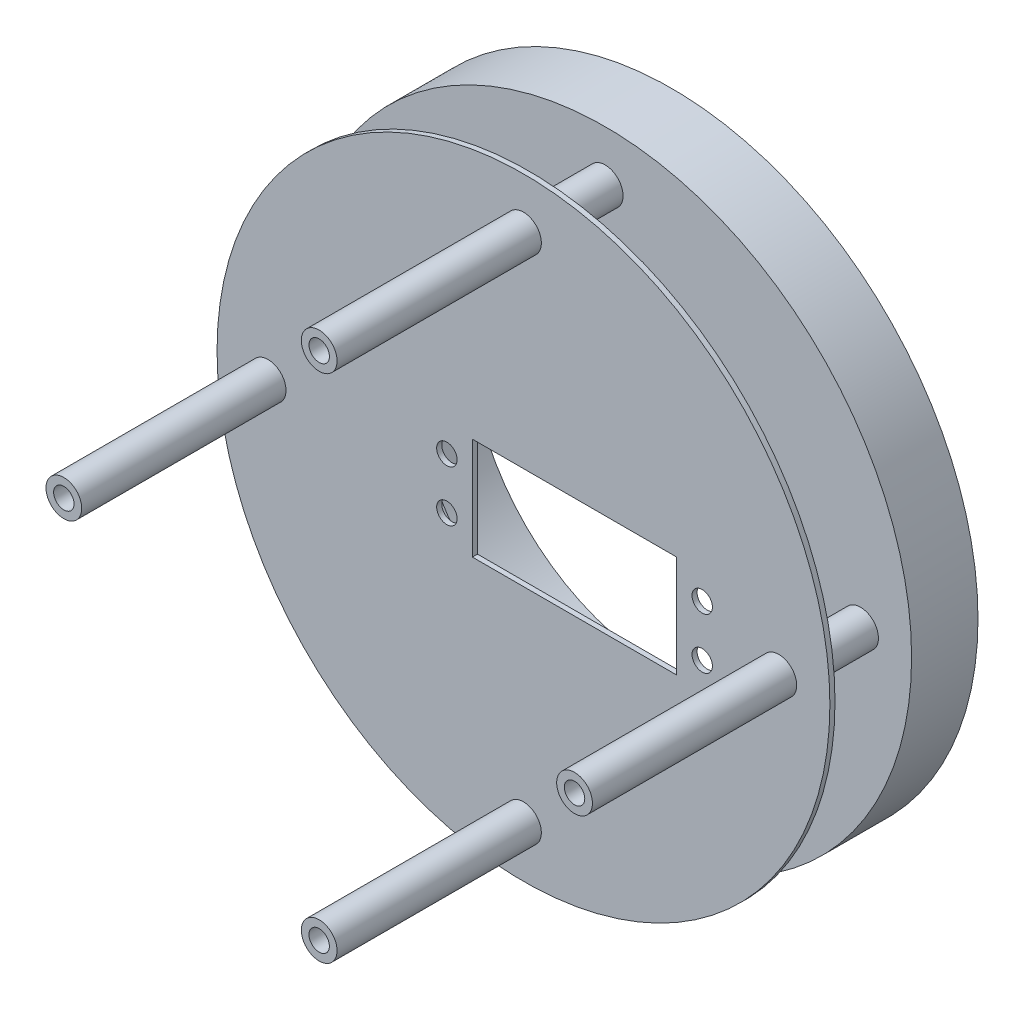
ISO-10303-21;
HEADER;
FILE_DESCRIPTION(('STEP AP214'),'2;1');
FILE_NAME('part.step','',(''),(''),'','','');
FILE_SCHEMA(('AUTOMOTIVE_DESIGN { 1 0 10303 214 1 1 1 1 }'));
ENDSEC;
DATA;
#1=APPLICATION_CONTEXT('core data for automotive mechanical design processes');
#2=APPLICATION_PROTOCOL_DEFINITION('international standard','automotive_design',2000,#1);
#3=PRODUCT_CONTEXT('',#1,'mechanical');
#4=PRODUCT('Part','Part','',(#3));
#5=PRODUCT_RELATED_PRODUCT_CATEGORY('part','',(#4));
#6=PRODUCT_DEFINITION_FORMATION('','',#4);
#7=PRODUCT_DEFINITION_CONTEXT('part definition',#1,'design');
#8=PRODUCT_DEFINITION('design','',#6,#7);
#9=PRODUCT_DEFINITION_SHAPE('','',#8);
#10=(LENGTH_UNIT() NAMED_UNIT(*) SI_UNIT(.MILLI.,.METRE.));
#11=(NAMED_UNIT(*) PLANE_ANGLE_UNIT() SI_UNIT($,.RADIAN.));
#12=(NAMED_UNIT(*) SI_UNIT($,.STERADIAN.) SOLID_ANGLE_UNIT());
#13=UNCERTAINTY_MEASURE_WITH_UNIT(LENGTH_MEASURE(1.E-05),#10,'distance_accuracy_value','');
#14=(GEOMETRIC_REPRESENTATION_CONTEXT(3) GLOBAL_UNCERTAINTY_ASSIGNED_CONTEXT((#13)) GLOBAL_UNIT_ASSIGNED_CONTEXT((#10,
#11,#12)) REPRESENTATION_CONTEXT('',''));
#15=CARTESIAN_POINT('',(0.,0.,0.));
#16=DIRECTION('',(0.,0.,1.));
#17=DIRECTION('',(1.,0.,0.));
#18=AXIS2_PLACEMENT_3D('',#15,#16,#17);
#19=CARTESIAN_POINT('',(0.,0.,13.));
#20=DIRECTION('',(0.,0.,-1.));
#21=DIRECTION('',(-1.,0.,0.));
#22=AXIS2_PLACEMENT_3D('',#19,#20,#21);
#23=CYLINDRICAL_SURFACE('',#22,37.5);
#24=CARTESIAN_POINT('',(0.,0.,13.));
#25=DIRECTION('',(0.,0.,1.));
#26=DIRECTION('',(1.,0.,0.));
#27=AXIS2_PLACEMENT_3D('',#24,#25,#26);
#28=CIRCLE('',#27,37.5);
#29=CARTESIAN_POINT('',(-37.5,0.,13.));
#30=VERTEX_POINT('',#29);
#31=EDGE_CURVE('E127',#30,#30,#28,.T.);
#32=CARTESIAN_POINT('',(0.,0.,2.));
#33=DIRECTION('',(0.,0.,-1.));
#34=DIRECTION('',(-1.,0.,0.));
#35=AXIS2_PLACEMENT_3D('',#32,#33,#34);
#36=CIRCLE('',#35,37.5);
#37=CARTESIAN_POINT('',(-37.5,0.,2.));
#38=VERTEX_POINT('',#37);
#39=EDGE_CURVE('E40',#38,#38,#36,.T.);
#40=CARTESIAN_POINT('',(-37.5,0.,13.));
#41=CARTESIAN_POINT('',(-37.5,0.,12.8854166666667));
#42=CARTESIAN_POINT('',(-37.5,0.,12.7708333333333));
#43=CARTESIAN_POINT('',(-37.5,0.,12.5416666666667));
#44=CARTESIAN_POINT('',(-37.5,0.,12.4270833333333));
#45=CARTESIAN_POINT('',(-37.5,0.,12.1979166666667));
#46=CARTESIAN_POINT('',(-37.5,0.,12.0833333333333));
#47=CARTESIAN_POINT('',(-37.5,0.,11.8541666666667));
#48=CARTESIAN_POINT('',(-37.5,0.,11.7395833333333));
#49=CARTESIAN_POINT('',(-37.5,0.,11.5104166666667));
#50=CARTESIAN_POINT('',(-37.5,0.,11.3958333333333));
#51=CARTESIAN_POINT('',(-37.5,0.,11.1666666666667));
#52=CARTESIAN_POINT('',(-37.5,0.,11.0520833333333));
#53=CARTESIAN_POINT('',(-37.5,0.,10.8229166666667));
#54=CARTESIAN_POINT('',(-37.5,0.,10.7083333333333));
#55=CARTESIAN_POINT('',(-37.5,0.,10.4791666666667));
#56=CARTESIAN_POINT('',(-37.5,0.,10.3645833333333));
#57=CARTESIAN_POINT('',(-37.5,0.,10.1354166666667));
#58=CARTESIAN_POINT('',(-37.5,0.,10.0208333333333));
#59=CARTESIAN_POINT('',(-37.5,0.,9.79166666666667));
#60=CARTESIAN_POINT('',(-37.5,0.,9.67708333333333));
#61=CARTESIAN_POINT('',(-37.5,0.,9.44791666666667));
#62=CARTESIAN_POINT('',(-37.5,0.,9.33333333333333));
#63=CARTESIAN_POINT('',(-37.5,0.,9.10416666666667));
#64=CARTESIAN_POINT('',(-37.5,0.,8.98958333333333));
#65=CARTESIAN_POINT('',(-37.5,0.,8.76041666666667));
#66=CARTESIAN_POINT('',(-37.5,0.,8.64583333333333));
#67=CARTESIAN_POINT('',(-37.5,0.,8.41666666666667));
#68=CARTESIAN_POINT('',(-37.5,0.,8.30208333333333));
#69=CARTESIAN_POINT('',(-37.5,0.,8.07291666666667));
#70=CARTESIAN_POINT('',(-37.5,0.,7.95833333333333));
#71=CARTESIAN_POINT('',(-37.5,0.,7.72916666666667));
#72=CARTESIAN_POINT('',(-37.5,0.,7.61458333333333));
#73=CARTESIAN_POINT('',(-37.5,0.,7.38541666666667));
#74=CARTESIAN_POINT('',(-37.5,0.,7.27083333333333));
#75=CARTESIAN_POINT('',(-37.5,0.,7.04166666666667));
#76=CARTESIAN_POINT('',(-37.5,0.,6.92708333333333));
#77=CARTESIAN_POINT('',(-37.5,0.,6.69791666666667));
#78=CARTESIAN_POINT('',(-37.5,0.,6.58333333333333));
#79=CARTESIAN_POINT('',(-37.5,0.,6.35416666666667));
#80=CARTESIAN_POINT('',(-37.5,0.,6.23958333333333));
#81=CARTESIAN_POINT('',(-37.5,0.,6.01041666666667));
#82=CARTESIAN_POINT('',(-37.5,0.,5.89583333333333));
#83=CARTESIAN_POINT('',(-37.5,0.,5.66666666666667));
#84=CARTESIAN_POINT('',(-37.5,0.,5.55208333333333));
#85=CARTESIAN_POINT('',(-37.5,0.,5.32291666666667));
#86=CARTESIAN_POINT('',(-37.5,0.,5.20833333333333));
#87=CARTESIAN_POINT('',(-37.5,0.,4.97916666666667));
#88=CARTESIAN_POINT('',(-37.5,0.,4.86458333333333));
#89=CARTESIAN_POINT('',(-37.5,0.,4.63541666666667));
#90=CARTESIAN_POINT('',(-37.5,0.,4.52083333333333));
#91=CARTESIAN_POINT('',(-37.5,0.,4.29166666666667));
#92=CARTESIAN_POINT('',(-37.5,0.,4.17708333333334));
#93=CARTESIAN_POINT('',(-37.5,0.,3.94791666666667));
#94=CARTESIAN_POINT('',(-37.5,0.,3.83333333333333));
#95=CARTESIAN_POINT('',(-37.5,0.,3.60416666666667));
#96=CARTESIAN_POINT('',(-37.5,0.,3.48958333333333));
#97=CARTESIAN_POINT('',(-37.5,0.,3.26041666666667));
#98=CARTESIAN_POINT('',(-37.5,0.,3.14583333333333));
#99=CARTESIAN_POINT('',(-37.5,0.,2.91666666666667));
#100=CARTESIAN_POINT('',(-37.5,0.,2.80208333333334));
#101=CARTESIAN_POINT('',(-37.5,0.,2.57291666666667));
#102=CARTESIAN_POINT('',(-37.5,0.,2.45833333333334));
#103=CARTESIAN_POINT('',(-37.5,0.,2.22916666666667));
#104=CARTESIAN_POINT('',(-37.5,0.,2.11458333333334));
#105=CARTESIAN_POINT('',(-37.5,0.,2.));
#106=B_SPLINE_CURVE_WITH_KNOTS('',3,(#40,#41,#42,#43,#44,#45,#46,#47,#48,#49,#50,#51,#52,#53,
#54,#55,#56,#57,#58,#59,#60,#61,#62,#63,#64,#65,#66,#67,#68,#69,#70,#71,#72,#73,#74,#75,#76,#77,
#78,#79,#80,#81,#82,#83,#84,#85,#86,#87,#88,#89,#90,#91,#92,#93,#94,#95,#96,#97,#98,#99,#100,
#101,#102,#103,#104,#105),.UNSPECIFIED.,.F.,.F.,(4,2,2,2,2,2,2,2,2,2,2,2,2,2,2,2,2,2,2,2,2,2,2,
2,2,2,2,2,2,2,2,2,4),(0.,0.34375,0.687500000000001,1.03125,1.375,1.71875,2.0625,2.40625,2.75,
3.09375,3.4375,3.78125,4.125,4.46875,4.8125,5.15625,5.5,5.84375,6.1875,6.53125,6.875,7.21875,
7.5625,7.90625,8.25,8.59375,8.9375,9.28125,9.625,9.96875,10.3125,10.65625,11.),.UNSPECIFIED.);
#107=EDGE_CURVE('BSEAM36',#30,#38,#106,.T.);
#108=ORIENTED_EDGE('',*,*,#31,.T.);
#109=ORIENTED_EDGE('',*,*,#39,.T.);
#110=ORIENTED_EDGE('',*,*,#107,.T.);
#111=ORIENTED_EDGE('',*,*,#107,.F.);
#112=EDGE_LOOP('',(#108,#110,#109,#111));
#113=FACE_BOUND('',#112,.T.);
#114=ADVANCED_FACE('F36',(#113),#23,.F.);
#115=CARTESIAN_POINT('',(50.,0.,69.));
#116=DIRECTION('',(0.,0.,-1.));
#117=DIRECTION('',(-1.,0.,0.));
#118=AXIS2_PLACEMENT_3D('',#115,#116,#117);
#119=CYLINDRICAL_SURFACE('',#118,3.5);
#120=CARTESIAN_POINT('',(50.,0.,13.));
#121=DIRECTION('',(0.,0.,1.));
#122=DIRECTION('',(1.,0.,0.));
#123=AXIS2_PLACEMENT_3D('',#120,#121,#122);
#124=CIRCLE('',#123,3.5);
#125=CARTESIAN_POINT('',(53.5,0.,13.));
#126=VERTEX_POINT('',#125);
#127=EDGE_CURVE('E128',#126,#126,#124,.T.);
#128=ORIENTED_EDGE('',*,*,#127,.T.);
#129=EDGE_LOOP('',(#128));
#130=FACE_BOUND('',#129,.T.);
#131=CARTESIAN_POINT('',(50.,0.,28.));
#132=DIRECTION('',(0.,0.,1.));
#133=DIRECTION('',(1.,0.,0.));
#134=AXIS2_PLACEMENT_3D('',#131,#132,#133);
#135=CIRCLE('',#134,3.5);
#136=CARTESIAN_POINT('',(53.5,0.,28.));
#137=VERTEX_POINT('',#136);
#138=EDGE_CURVE('E137',#137,#137,#135,.T.);
#139=ORIENTED_EDGE('',*,*,#138,.F.);
#140=EDGE_LOOP('',(#139));
#141=FACE_BOUND('',#140,.T.);
#142=ADVANCED_FACE('F219',(#130,#141),#119,.T.);
#143=CARTESIAN_POINT('',(0.,0.,13.));
#144=DIRECTION('',(0.,0.,1.));
#145=DIRECTION('',(1.,0.,0.));
#146=AXIS2_PLACEMENT_3D('',#143,#144,#145);
#147=PLANE('',#146);
#148=CARTESIAN_POINT('',(0.,50.,13.));
#149=DIRECTION('',(0.,0.,1.));
#150=DIRECTION('',(1.,0.,0.));
#151=AXIS2_PLACEMENT_3D('',#148,#149,#150);
#152=CIRCLE('',#151,3.5);
#153=CARTESIAN_POINT('',(3.5,50.,13.));
#154=VERTEX_POINT('',#153);
#155=EDGE_CURVE('E255',#154,#154,#152,.T.);
#156=ORIENTED_EDGE('',*,*,#155,.F.);
#157=EDGE_LOOP('',(#156));
#158=FACE_BOUND('',#157,.T.);
#159=CARTESIAN_POINT('',(-50.,0.,13.));
#160=DIRECTION('',(0.,0.,1.));
#161=DIRECTION('',(1.,0.,0.));
#162=AXIS2_PLACEMENT_3D('',#159,#160,#161);
#163=CIRCLE('',#162,3.5);
#164=CARTESIAN_POINT('',(-46.5,0.,13.));
#165=VERTEX_POINT('',#164);
#166=EDGE_CURVE('E285',#165,#165,#163,.T.);
#167=ORIENTED_EDGE('',*,*,#166,.F.);
#168=EDGE_LOOP('',(#167));
#169=FACE_BOUND('',#168,.T.);
#170=CARTESIAN_POINT('',(0.,-50.,13.));
#171=DIRECTION('',(0.,0.,1.));
#172=DIRECTION('',(1.,0.,0.));
#173=AXIS2_PLACEMENT_3D('',#170,#171,#172);
#174=CIRCLE('',#173,3.5);
#175=CARTESIAN_POINT('',(3.5,-50.,13.));
#176=VERTEX_POINT('',#175);
#177=EDGE_CURVE('E294',#176,#176,#174,.T.);
#178=ORIENTED_EDGE('',*,*,#177,.F.);
#179=EDGE_LOOP('',(#178));
#180=FACE_BOUND('',#179,.T.);
#181=ORIENTED_EDGE('',*,*,#127,.F.);
#182=EDGE_LOOP('',(#181));
#183=FACE_BOUND('',#182,.T.);
#184=CARTESIAN_POINT('',(0.,0.,13.));
#185=DIRECTION('',(0.,0.,1.));
#186=DIRECTION('',(1.,0.,0.));
#187=AXIS2_PLACEMENT_3D('',#184,#185,#186);
#188=CIRCLE('',#187,60.);
#189=CARTESIAN_POINT('',(-60.,0.,13.));
#190=VERTEX_POINT('',#189);
#191=EDGE_CURVE('E134',#190,#190,#188,.T.);
#192=ORIENTED_EDGE('',*,*,#191,.T.);
#193=EDGE_LOOP('',(#192));
#194=FACE_BOUND('',#193,.T.);
#195=ORIENTED_EDGE('',*,*,#31,.F.);
#196=EDGE_LOOP('',(#195));
#197=FACE_BOUND('',#196,.T.);
#198=ADVANCED_FACE('F225',(#158,#169,#180,#183,#194,#197),#147,.T.);
#199=CARTESIAN_POINT('',(0.,0.,0.));
#200=DIRECTION('',(0.,0.,1.));
#201=DIRECTION('',(1.,0.,0.));
#202=AXIS2_PLACEMENT_3D('',#199,#200,#201);
#203=PLANE('',#202);
#204=CARTESIAN_POINT('',(0.,0.,0.));
#205=DIRECTION('',(0.,0.,-1.));
#206=DIRECTION('',(-1.,0.,0.));
#207=AXIS2_PLACEMENT_3D('',#204,#205,#206);
#208=CIRCLE('',#207,45.);
#209=CARTESIAN_POINT('',(-45.,0.,0.));
#210=VERTEX_POINT('',#209);
#211=EDGE_CURVE('E243',#210,#210,#208,.T.);
#212=ORIENTED_EDGE('',*,*,#211,.F.);
#213=EDGE_LOOP('',(#212));
#214=FACE_BOUND('',#213,.T.);
#215=CARTESIAN_POINT('',(0.,0.,0.));
#216=DIRECTION('',(0.,0.,1.));
#217=DIRECTION('',(1.,0.,0.));
#218=AXIS2_PLACEMENT_3D('',#215,#216,#217);
#219=CIRCLE('',#218,60.);
#220=CARTESIAN_POINT('',(-60.,0.,0.));
#221=VERTEX_POINT('',#220);
#222=EDGE_CURVE('E133',#221,#221,#219,.T.);
#223=ORIENTED_EDGE('',*,*,#222,.F.);
#224=EDGE_LOOP('',(#223));
#225=FACE_BOUND('',#224,.T.);
#226=ADVANCED_FACE('F232',(#214,#225),#203,.F.);
#227=CARTESIAN_POINT('',(0.,0.,13.));
#228=DIRECTION('',(0.,0.,-1.));
#229=DIRECTION('',(-1.,0.,0.));
#230=AXIS2_PLACEMENT_3D('',#227,#228,#229);
#231=CYLINDRICAL_SURFACE('',#230,60.);
#232=CARTESIAN_POINT('',(-60.,0.,13.));
#233=CARTESIAN_POINT('',(-60.,0.,12.8645833333333));
#234=CARTESIAN_POINT('',(-60.,0.,12.7291666666667));
#235=CARTESIAN_POINT('',(-60.,0.,12.4583333333333));
#236=CARTESIAN_POINT('',(-60.,0.,12.3229166666667));
#237=CARTESIAN_POINT('',(-60.,0.,12.0520833333333));
#238=CARTESIAN_POINT('',(-60.,0.,11.9166666666667));
#239=CARTESIAN_POINT('',(-60.,0.,11.6458333333333));
#240=CARTESIAN_POINT('',(-60.,0.,11.5104166666667));
#241=CARTESIAN_POINT('',(-60.,0.,11.2395833333333));
#242=CARTESIAN_POINT('',(-60.,0.,11.1041666666667));
#243=CARTESIAN_POINT('',(-60.,0.,10.8333333333333));
#244=CARTESIAN_POINT('',(-60.,0.,10.6979166666667));
#245=CARTESIAN_POINT('',(-60.,0.,10.4270833333333));
#246=CARTESIAN_POINT('',(-60.,0.,10.2916666666667));
#247=CARTESIAN_POINT('',(-60.,0.,10.0208333333333));
#248=CARTESIAN_POINT('',(-60.,0.,9.88541666666667));
#249=CARTESIAN_POINT('',(-60.,0.,9.61458333333333));
#250=CARTESIAN_POINT('',(-60.,0.,9.47916666666667));
#251=CARTESIAN_POINT('',(-60.,0.,9.20833333333333));
#252=CARTESIAN_POINT('',(-60.,0.,9.07291666666666));
#253=CARTESIAN_POINT('',(-60.,0.,8.80208333333333));
#254=CARTESIAN_POINT('',(-60.,0.,8.66666666666667));
#255=CARTESIAN_POINT('',(-60.,0.,8.39583333333333));
#256=CARTESIAN_POINT('',(-60.,0.,8.26041666666667));
#257=CARTESIAN_POINT('',(-60.,0.,7.98958333333333));
#258=CARTESIAN_POINT('',(-60.,0.,7.85416666666667));
#259=CARTESIAN_POINT('',(-60.,0.,7.58333333333333));
#260=CARTESIAN_POINT('',(-60.,0.,7.44791666666667));
#261=CARTESIAN_POINT('',(-60.,0.,7.17708333333333));
#262=CARTESIAN_POINT('',(-60.,0.,7.04166666666667));
#263=CARTESIAN_POINT('',(-60.,0.,6.77083333333333));
#264=CARTESIAN_POINT('',(-60.,0.,6.63541666666667));
#265=CARTESIAN_POINT('',(-60.,0.,6.36458333333333));
#266=CARTESIAN_POINT('',(-60.,0.,6.22916666666667));
#267=CARTESIAN_POINT('',(-60.,0.,5.95833333333333));
#268=CARTESIAN_POINT('',(-60.,0.,5.82291666666667));
#269=CARTESIAN_POINT('',(-60.,0.,5.55208333333333));
#270=CARTESIAN_POINT('',(-60.,0.,5.41666666666667));
#271=CARTESIAN_POINT('',(-60.,0.,5.14583333333333));
#272=CARTESIAN_POINT('',(-60.,0.,5.01041666666667));
#273=CARTESIAN_POINT('',(-60.,0.,4.73958333333333));
#274=CARTESIAN_POINT('',(-60.,0.,4.60416666666667));
#275=CARTESIAN_POINT('',(-60.,0.,4.33333333333333));
#276=CARTESIAN_POINT('',(-60.,0.,4.19791666666667));
#277=CARTESIAN_POINT('',(-60.,0.,3.92708333333333));
#278=CARTESIAN_POINT('',(-60.,0.,3.79166666666667));
#279=CARTESIAN_POINT('',(-60.,0.,3.52083333333333));
#280=CARTESIAN_POINT('',(-60.,0.,3.38541666666667));
#281=CARTESIAN_POINT('',(-60.,0.,3.11458333333333));
#282=CARTESIAN_POINT('',(-60.,0.,2.97916666666667));
#283=CARTESIAN_POINT('',(-60.,0.,2.70833333333333));
#284=CARTESIAN_POINT('',(-60.,0.,2.57291666666667));
#285=CARTESIAN_POINT('',(-60.,0.,2.30208333333333));
#286=CARTESIAN_POINT('',(-60.,0.,2.16666666666667));
#287=CARTESIAN_POINT('',(-60.,0.,1.89583333333333));
#288=CARTESIAN_POINT('',(-60.,0.,1.76041666666667));
#289=CARTESIAN_POINT('',(-60.,0.,1.48958333333333));
#290=CARTESIAN_POINT('',(-60.,0.,1.35416666666667));
#291=CARTESIAN_POINT('',(-60.,0.,1.08333333333333));
#292=CARTESIAN_POINT('',(-60.,0.,0.947916666666667));
#293=CARTESIAN_POINT('',(-60.,0.,0.677083333333334));
#294=CARTESIAN_POINT('',(-60.,0.,0.541666666666667));
#295=CARTESIAN_POINT('',(-60.,0.,0.270833333333334));
#296=CARTESIAN_POINT('',(-60.,0.,0.135416666666667));
#297=CARTESIAN_POINT('',(-60.,0.,0.));
#298=B_SPLINE_CURVE_WITH_KNOTS('',3,(#232,#233,#234,#235,#236,#237,#238,#239,#240,#241,#242,
#243,#244,#245,#246,#247,#248,#249,#250,#251,#252,#253,#254,#255,#256,#257,#258,#259,#260,#261,
#262,#263,#264,#265,#266,#267,#268,#269,#270,#271,#272,#273,#274,#275,#276,#277,#278,#279,#280,
#281,#282,#283,#284,#285,#286,#287,#288,#289,#290,#291,#292,#293,#294,#295,#296,#297),
.UNSPECIFIED.,.F.,.F.,(4,2,2,2,2,2,2,2,2,2,2,2,2,2,2,2,2,2,2,2,2,2,2,2,2,2,2,2,2,2,2,2,4),(0.,
0.40625,0.812500000000001,1.21875,1.625,2.03125,2.4375,2.84375,3.25,3.65625,4.0625,4.46875,
4.875,5.28125,5.6875,6.09375,6.5,6.90625,7.3125,7.71875,8.125,8.53125,8.9375,9.34375,9.75,
10.15625,10.5625,10.96875,11.375,11.78125,12.1875,12.59375,13.),.UNSPECIFIED.);
#299=EDGE_CURVE('BSEAM38',#190,#221,#298,.T.);
#300=ORIENTED_EDGE('',*,*,#191,.F.);
#301=ORIENTED_EDGE('',*,*,#222,.T.);
#302=ORIENTED_EDGE('',*,*,#299,.T.);
#303=ORIENTED_EDGE('',*,*,#299,.F.);
#304=EDGE_LOOP('',(#300,#302,#301,#303));
#305=FACE_BOUND('',#304,.T.);
#306=ADVANCED_FACE('F38',(#305),#231,.T.);
#307=CARTESIAN_POINT('',(0.,0.,29.));
#308=DIRECTION('',(0.,0.,1.));
#309=DIRECTION('',(1.,0.,0.));
#310=AXIS2_PLACEMENT_3D('',#307,#308,#309);
#311=PLANE('',#310);
#312=CARTESIAN_POINT('',(0.,50.,29.));
#313=DIRECTION('',(0.,0.,1.));
#314=DIRECTION('',(1.,0.,0.));
#315=AXIS2_PLACEMENT_3D('',#312,#313,#314);
#316=CIRCLE('',#315,3.5);
#317=CARTESIAN_POINT('',(3.5,50.,29.));
#318=VERTEX_POINT('',#317);
#319=EDGE_CURVE('E280',#318,#318,#316,.F.);
#320=ORIENTED_EDGE('',*,*,#319,.T.);
#321=EDGE_LOOP('',(#320));
#322=FACE_BOUND('',#321,.T.);
#323=CARTESIAN_POINT('',(-50.,0.,29.));
#324=DIRECTION('',(0.,0.,1.));
#325=DIRECTION('',(1.,0.,0.));
#326=AXIS2_PLACEMENT_3D('',#323,#324,#325);
#327=CIRCLE('',#326,3.5);
#328=CARTESIAN_POINT('',(-46.5,0.,29.));
#329=VERTEX_POINT('',#328);
#330=EDGE_CURVE('E289',#329,#329,#327,.F.);
#331=ORIENTED_EDGE('',*,*,#330,.T.);
#332=EDGE_LOOP('',(#331));
#333=FACE_BOUND('',#332,.T.);
#334=CARTESIAN_POINT('',(0.,-50.,29.));
#335=DIRECTION('',(0.,0.,1.));
#336=DIRECTION('',(1.,0.,0.));
#337=AXIS2_PLACEMENT_3D('',#334,#335,#336);
#338=CIRCLE('',#337,3.5);
#339=CARTESIAN_POINT('',(3.5,-50.,29.));
#340=VERTEX_POINT('',#339);
#341=EDGE_CURVE('E182',#340,#340,#338,.F.);
#342=ORIENTED_EDGE('',*,*,#341,.T.);
#343=EDGE_LOOP('',(#342));
#344=FACE_BOUND('',#343,.T.);
#345=CARTESIAN_POINT('',(50.,0.,29.));
#346=DIRECTION('',(0.,0.,1.));
#347=DIRECTION('',(1.,0.,0.));
#348=AXIS2_PLACEMENT_3D('',#345,#346,#347);
#349=CIRCLE('',#348,3.5);
#350=CARTESIAN_POINT('',(53.5,0.,29.));
#351=VERTEX_POINT('',#350);
#352=EDGE_CURVE('E121',#351,#351,#349,.T.);
#353=ORIENTED_EDGE('',*,*,#352,.F.);
#354=EDGE_LOOP('',(#353));
#355=FACE_BOUND('',#354,.T.);
#356=CARTESIAN_POINT('',(35.,-5.,29.));
#357=DIRECTION('',(0.,0.,1.));
#358=DIRECTION('',(1.,0.,0.));
#359=AXIS2_PLACEMENT_3D('',#356,#357,#358);
#360=CIRCLE('',#359,2.);
#361=CARTESIAN_POINT('',(37.,-5.,29.));
#362=VERTEX_POINT('',#361);
#363=EDGE_CURVE('E190',#362,#362,#360,.T.);
#364=ORIENTED_EDGE('',*,*,#363,.F.);
#365=EDGE_LOOP('',(#364));
#366=FACE_BOUND('',#365,.T.);
#367=CARTESIAN_POINT('',(-15.,5.,29.));
#368=DIRECTION('',(0.,0.,1.));
#369=DIRECTION('',(1.,0.,0.));
#370=AXIS2_PLACEMENT_3D('',#367,#368,#369);
#371=CIRCLE('',#370,2.);
#372=CARTESIAN_POINT('',(-13.,5.,29.));
#373=VERTEX_POINT('',#372);
#374=EDGE_CURVE('E108',#373,#373,#371,.T.);
#375=ORIENTED_EDGE('',*,*,#374,.F.);
#376=EDGE_LOOP('',(#375));
#377=FACE_BOUND('',#376,.T.);
#378=CARTESIAN_POINT('',(0.,0.,29.));
#379=DIRECTION('',(0.,0.,1.));
#380=DIRECTION('',(1.,0.,0.));
#381=AXIS2_PLACEMENT_3D('',#378,#379,#380);
#382=CIRCLE('',#381,60.);
#383=CARTESIAN_POINT('',(60.,0.,29.));
#384=VERTEX_POINT('',#383);
#385=EDGE_CURVE('E118',#384,#384,#382,.T.);
#386=ORIENTED_EDGE('',*,*,#385,.T.);
#387=EDGE_LOOP('',(#386));
#388=FACE_BOUND('',#387,.T.);
#389=DIRECTION('',(1.,0.,0.));
#390=VECTOR('',#389,1.);
#391=CARTESIAN_POINT('',(-10.,-10.,29.));
#392=LINE('',#391,#390);
#393=CARTESIAN_POINT('',(-10.,-10.,29.));
#394=VERTEX_POINT('',#393);
#395=CARTESIAN_POINT('',(30.,-10.,29.));
#396=VERTEX_POINT('',#395);
#397=EDGE_CURVE('E86',#394,#396,#392,.T.);
#398=ORIENTED_EDGE('',*,*,#397,.F.);
#399=DIRECTION('',(0.,-1.,0.));
#400=VECTOR('',#399,1.);
#401=CARTESIAN_POINT('',(-10.,10.,29.));
#402=LINE('',#401,#400);
#403=CARTESIAN_POINT('',(-10.,10.,29.));
#404=VERTEX_POINT('',#403);
#405=EDGE_CURVE('E78',#404,#394,#402,.T.);
#406=ORIENTED_EDGE('',*,*,#405,.F.);
#407=DIRECTION('',(-1.,0.,0.));
#408=VECTOR('',#407,1.);
#409=CARTESIAN_POINT('',(-10.,10.,29.));
#410=LINE('',#409,#408);
#411=CARTESIAN_POINT('',(30.,10.,29.));
#412=VERTEX_POINT('',#411);
#413=EDGE_CURVE('E102',#412,#404,#410,.T.);
#414=ORIENTED_EDGE('',*,*,#413,.F.);
#415=DIRECTION('',(0.,1.,0.));
#416=VECTOR('',#415,1.);
#417=CARTESIAN_POINT('',(30.,10.,29.));
#418=LINE('',#417,#416);
#419=EDGE_CURVE('E100',#396,#412,#418,.T.);
#420=ORIENTED_EDGE('',*,*,#419,.F.);
#421=EDGE_LOOP('',(#398,#406,#414,#420));
#422=FACE_BOUND('',#421,.T.);
#423=CARTESIAN_POINT('',(35.,5.,29.));
#424=DIRECTION('',(0.,0.,1.));
#425=DIRECTION('',(1.,0.,0.));
#426=AXIS2_PLACEMENT_3D('',#423,#424,#425);
#427=CIRCLE('',#426,2.);
#428=CARTESIAN_POINT('',(37.,5.,29.));
#429=VERTEX_POINT('',#428);
#430=EDGE_CURVE('E194',#429,#429,#427,.T.);
#431=ORIENTED_EDGE('',*,*,#430,.F.);
#432=EDGE_LOOP('',(#431));
#433=FACE_BOUND('',#432,.T.);
#434=CARTESIAN_POINT('',(-15.,-5.,29.));
#435=DIRECTION('',(0.,0.,1.));
#436=DIRECTION('',(1.,0.,0.));
#437=AXIS2_PLACEMENT_3D('',#434,#435,#436);
#438=CIRCLE('',#437,2.);
#439=CARTESIAN_POINT('',(-13.,-5.,29.));
#440=VERTEX_POINT('',#439);
#441=EDGE_CURVE('E181',#440,#440,#438,.T.);
#442=ORIENTED_EDGE('',*,*,#441,.F.);
#443=EDGE_LOOP('',(#442));
#444=FACE_BOUND('',#443,.T.);
#445=ADVANCED_FACE('F98',(#322,#333,#344,#355,#366,#377,#388,#422,#433,#444),#311,.T.);
#446=CARTESIAN_POINT('',(0.,0.,28.));
#447=DIRECTION('',(0.,0.,1.));
#448=DIRECTION('',(1.,0.,0.));
#449=AXIS2_PLACEMENT_3D('',#446,#447,#448);
#450=PLANE('',#449);
#451=CARTESIAN_POINT('',(0.,50.,28.));
#452=DIRECTION('',(0.,0.,1.));
#453=DIRECTION('',(1.,0.,0.));
#454=AXIS2_PLACEMENT_3D('',#451,#452,#453);
#455=CIRCLE('',#454,3.5);
#456=CARTESIAN_POINT('',(3.5,50.,28.));
#457=VERTEX_POINT('',#456);
#458=EDGE_CURVE('E11',#457,#457,#455,.F.);
#459=ORIENTED_EDGE('',*,*,#458,.F.);
#460=EDGE_LOOP('',(#459));
#461=FACE_BOUND('',#460,.T.);
#462=CARTESIAN_POINT('',(-50.,0.,28.));
#463=DIRECTION('',(0.,0.,1.));
#464=DIRECTION('',(1.,0.,0.));
#465=AXIS2_PLACEMENT_3D('',#462,#463,#464);
#466=CIRCLE('',#465,3.5);
#467=CARTESIAN_POINT('',(-46.5,0.,28.));
#468=VERTEX_POINT('',#467);
#469=EDGE_CURVE('E45',#468,#468,#466,.F.);
#470=ORIENTED_EDGE('',*,*,#469,.F.);
#471=EDGE_LOOP('',(#470));
#472=FACE_BOUND('',#471,.T.);
#473=CARTESIAN_POINT('',(0.,-50.,28.));
#474=DIRECTION('',(0.,0.,1.));
#475=DIRECTION('',(1.,0.,0.));
#476=AXIS2_PLACEMENT_3D('',#473,#474,#475);
#477=CIRCLE('',#476,3.5);
#478=CARTESIAN_POINT('',(3.5,-50.,28.));
#479=VERTEX_POINT('',#478);
#480=EDGE_CURVE('E142',#479,#479,#477,.F.);
#481=ORIENTED_EDGE('',*,*,#480,.F.);
#482=EDGE_LOOP('',(#481));
#483=FACE_BOUND('',#482,.T.);
#484=ORIENTED_EDGE('',*,*,#138,.T.);
#485=EDGE_LOOP('',(#484));
#486=FACE_BOUND('',#485,.T.);
#487=CARTESIAN_POINT('',(0.,0.,28.));
#488=DIRECTION('',(0.,0.,1.));
#489=DIRECTION('',(1.,0.,0.));
#490=AXIS2_PLACEMENT_3D('',#487,#488,#489);
#491=CIRCLE('',#490,60.);
#492=CARTESIAN_POINT('',(60.,0.,28.));
#493=VERTEX_POINT('',#492);
#494=EDGE_CURVE('E94',#493,#493,#491,.T.);
#495=ORIENTED_EDGE('',*,*,#494,.F.);
#496=EDGE_LOOP('',(#495));
#497=FACE_BOUND('',#496,.T.);
#498=DIRECTION('',(0.,-1.,0.));
#499=VECTOR('',#498,1.);
#500=CARTESIAN_POINT('',(-10.,10.,28.));
#501=LINE('',#500,#499);
#502=CARTESIAN_POINT('',(-10.,10.,28.));
#503=VERTEX_POINT('',#502);
#504=CARTESIAN_POINT('',(-10.,-10.,28.));
#505=VERTEX_POINT('',#504);
#506=EDGE_CURVE('E60',#503,#505,#501,.T.);
#507=ORIENTED_EDGE('',*,*,#506,.T.);
#508=DIRECTION('',(1.,0.,0.));
#509=VECTOR('',#508,1.);
#510=CARTESIAN_POINT('',(-10.,-10.,28.));
#511=LINE('',#510,#509);
#512=CARTESIAN_POINT('',(30.,-10.,28.));
#513=VERTEX_POINT('',#512);
#514=EDGE_CURVE('E93',#505,#513,#511,.T.);
#515=ORIENTED_EDGE('',*,*,#514,.T.);
#516=DIRECTION('',(0.,1.,0.));
#517=VECTOR('',#516,1.);
#518=CARTESIAN_POINT('',(30.,10.,28.));
#519=LINE('',#518,#517);
#520=CARTESIAN_POINT('',(30.,10.,28.));
#521=VERTEX_POINT('',#520);
#522=EDGE_CURVE('E110',#513,#521,#519,.T.);
#523=ORIENTED_EDGE('',*,*,#522,.T.);
#524=DIRECTION('',(-1.,0.,0.));
#525=VECTOR('',#524,1.);
#526=CARTESIAN_POINT('',(-10.,10.,28.));
#527=LINE('',#526,#525);
#528=EDGE_CURVE('E87',#521,#503,#527,.T.);
#529=ORIENTED_EDGE('',*,*,#528,.T.);
#530=EDGE_LOOP('',(#507,#515,#523,#529));
#531=FACE_BOUND('',#530,.T.);
#532=CARTESIAN_POINT('',(-15.,5.,28.));
#533=DIRECTION('',(0.,0.,1.));
#534=DIRECTION('',(1.,0.,0.));
#535=AXIS2_PLACEMENT_3D('',#532,#533,#534);
#536=CIRCLE('',#535,2.);
#537=CARTESIAN_POINT('',(-13.,5.,28.));
#538=VERTEX_POINT('',#537);
#539=EDGE_CURVE('E168',#538,#538,#536,.T.);
#540=ORIENTED_EDGE('',*,*,#539,.T.);
#541=EDGE_LOOP('',(#540));
#542=FACE_BOUND('',#541,.T.);
#543=CARTESIAN_POINT('',(35.,5.,28.));
#544=DIRECTION('',(0.,0.,1.));
#545=DIRECTION('',(1.,0.,0.));
#546=AXIS2_PLACEMENT_3D('',#543,#544,#545);
#547=CIRCLE('',#546,2.);
#548=CARTESIAN_POINT('',(37.,5.,28.));
#549=VERTEX_POINT('',#548);
#550=EDGE_CURVE('E172',#549,#549,#547,.T.);
#551=ORIENTED_EDGE('',*,*,#550,.T.);
#552=EDGE_LOOP('',(#551));
#553=FACE_BOUND('',#552,.T.);
#554=CARTESIAN_POINT('',(35.,-5.,28.));
#555=DIRECTION('',(0.,0.,1.));
#556=DIRECTION('',(1.,0.,0.));
#557=AXIS2_PLACEMENT_3D('',#554,#555,#556);
#558=CIRCLE('',#557,2.);
#559=CARTESIAN_POINT('',(37.,-5.,28.));
#560=VERTEX_POINT('',#559);
#561=EDGE_CURVE('E176',#560,#560,#558,.T.);
#562=ORIENTED_EDGE('',*,*,#561,.T.);
#563=EDGE_LOOP('',(#562));
#564=FACE_BOUND('',#563,.T.);
#565=CARTESIAN_POINT('',(-15.,-5.,28.));
#566=DIRECTION('',(0.,0.,1.));
#567=DIRECTION('',(1.,0.,0.));
#568=AXIS2_PLACEMENT_3D('',#565,#566,#567);
#569=CIRCLE('',#568,2.);
#570=CARTESIAN_POINT('',(-13.,-5.,28.));
#571=VERTEX_POINT('',#570);
#572=EDGE_CURVE('E179',#571,#571,#569,.T.);
#573=ORIENTED_EDGE('',*,*,#572,.T.);
#574=EDGE_LOOP('',(#573));
#575=FACE_BOUND('',#574,.T.);
#576=ADVANCED_FACE('F152',(#461,#472,#483,#486,#497,#531,#542,#553,#564,#575),#450,.F.);
#577=CARTESIAN_POINT('',(0.,0.,29.));
#578=DIRECTION('',(0.,0.,-1.));
#579=DIRECTION('',(-1.,0.,0.));
#580=AXIS2_PLACEMENT_3D('',#577,#578,#579);
#581=CYLINDRICAL_SURFACE('',#580,60.);
#582=ORIENTED_EDGE('',*,*,#385,.F.);
#583=EDGE_LOOP('',(#582));
#584=FACE_BOUND('',#583,.T.);
#585=ORIENTED_EDGE('',*,*,#494,.T.);
#586=EDGE_LOOP('',(#585));
#587=FACE_BOUND('',#586,.T.);
#588=ADVANCED_FACE('F155',(#584,#587),#581,.T.);
#589=CARTESIAN_POINT('',(-10.,10.,29.));
#590=DIRECTION('',(1.,0.,0.));
#591=DIRECTION('',(0.,0.,-1.));
#592=AXIS2_PLACEMENT_3D('',#589,#590,#591);
#593=PLANE('',#592);
#594=ORIENTED_EDGE('',*,*,#506,.F.);
#595=DIRECTION('',(0.,0.,-1.));
#596=VECTOR('',#595,1.);
#597=CARTESIAN_POINT('',(-10.,10.,29.));
#598=LINE('',#597,#596);
#599=EDGE_CURVE('E82',#404,#503,#598,.T.);
#600=ORIENTED_EDGE('',*,*,#599,.F.);
#601=ORIENTED_EDGE('',*,*,#405,.T.);
#602=DIRECTION('',(0.,0.,-1.));
#603=VECTOR('',#602,1.);
#604=CARTESIAN_POINT('',(-10.,-10.,29.));
#605=LINE('',#604,#603);
#606=EDGE_CURVE('E81',#394,#505,#605,.T.);
#607=ORIENTED_EDGE('',*,*,#606,.T.);
#608=EDGE_LOOP('',(#594,#600,#601,#607));
#609=FACE_BOUND('',#608,.T.);
#610=ADVANCED_FACE('F80',(#609),#593,.T.);
#611=CARTESIAN_POINT('',(-10.,-10.,29.));
#612=DIRECTION('',(0.,1.,0.));
#613=DIRECTION('',(0.,0.,1.));
#614=AXIS2_PLACEMENT_3D('',#611,#612,#613);
#615=PLANE('',#614);
#616=ORIENTED_EDGE('',*,*,#514,.F.);
#617=ORIENTED_EDGE('',*,*,#606,.F.);
#618=ORIENTED_EDGE('',*,*,#397,.T.);
#619=DIRECTION('',(0.,0.,-1.));
#620=VECTOR('',#619,1.);
#621=CARTESIAN_POINT('',(30.,-10.,29.));
#622=LINE('',#621,#620);
#623=EDGE_CURVE('E95',#396,#513,#622,.T.);
#624=ORIENTED_EDGE('',*,*,#623,.T.);
#625=EDGE_LOOP('',(#616,#617,#618,#624));
#626=FACE_BOUND('',#625,.T.);
#627=ADVANCED_FACE('F90',(#626),#615,.T.);
#628=CARTESIAN_POINT('',(30.,10.,29.));
#629=DIRECTION('',(-1.,0.,0.));
#630=DIRECTION('',(0.,0.,1.));
#631=AXIS2_PLACEMENT_3D('',#628,#629,#630);
#632=PLANE('',#631);
#633=ORIENTED_EDGE('',*,*,#522,.F.);
#634=ORIENTED_EDGE('',*,*,#623,.F.);
#635=ORIENTED_EDGE('',*,*,#419,.T.);
#636=DIRECTION('',(0.,0.,-1.));
#637=VECTOR('',#636,1.);
#638=CARTESIAN_POINT('',(30.,10.,29.));
#639=LINE('',#638,#637);
#640=EDGE_CURVE('E52',#412,#521,#639,.T.);
#641=ORIENTED_EDGE('',*,*,#640,.T.);
#642=EDGE_LOOP('',(#633,#634,#635,#641));
#643=FACE_BOUND('',#642,.T.);
#644=ADVANCED_FACE('F341',(#643),#632,.T.);
#645=CARTESIAN_POINT('',(-10.,10.,29.));
#646=DIRECTION('',(0.,-1.,0.));
#647=DIRECTION('',(0.,0.,-1.));
#648=AXIS2_PLACEMENT_3D('',#645,#646,#647);
#649=PLANE('',#648);
#650=ORIENTED_EDGE('',*,*,#528,.F.);
#651=ORIENTED_EDGE('',*,*,#640,.F.);
#652=ORIENTED_EDGE('',*,*,#413,.T.);
#653=ORIENTED_EDGE('',*,*,#599,.T.);
#654=EDGE_LOOP('',(#650,#651,#652,#653));
#655=FACE_BOUND('',#654,.T.);
#656=ADVANCED_FACE('F338',(#655),#649,.T.);
#657=CARTESIAN_POINT('',(-15.,5.,29.));
#658=DIRECTION('',(0.,0.,-1.));
#659=DIRECTION('',(-1.,0.,0.));
#660=AXIS2_PLACEMENT_3D('',#657,#658,#659);
#661=CYLINDRICAL_SURFACE('',#660,2.);
#662=ORIENTED_EDGE('',*,*,#374,.T.);
#663=EDGE_LOOP('',(#662));
#664=FACE_BOUND('',#663,.T.);
#665=ORIENTED_EDGE('',*,*,#539,.F.);
#666=EDGE_LOOP('',(#665));
#667=FACE_BOUND('',#666,.T.);
#668=ADVANCED_FACE('F201',(#664,#667),#661,.F.);
#669=CARTESIAN_POINT('',(35.,5.,29.));
#670=DIRECTION('',(0.,0.,-1.));
#671=DIRECTION('',(-1.,0.,0.));
#672=AXIS2_PLACEMENT_3D('',#669,#670,#671);
#673=CYLINDRICAL_SURFACE('',#672,2.);
#674=ORIENTED_EDGE('',*,*,#430,.T.);
#675=EDGE_LOOP('',(#674));
#676=FACE_BOUND('',#675,.T.);
#677=ORIENTED_EDGE('',*,*,#550,.F.);
#678=EDGE_LOOP('',(#677));
#679=FACE_BOUND('',#678,.T.);
#680=ADVANCED_FACE('F331',(#676,#679),#673,.F.);
#681=CARTESIAN_POINT('',(35.,-5.,29.));
#682=DIRECTION('',(0.,0.,-1.));
#683=DIRECTION('',(-1.,0.,0.));
#684=AXIS2_PLACEMENT_3D('',#681,#682,#683);
#685=CYLINDRICAL_SURFACE('',#684,2.);
#686=ORIENTED_EDGE('',*,*,#363,.T.);
#687=EDGE_LOOP('',(#686));
#688=FACE_BOUND('',#687,.T.);
#689=ORIENTED_EDGE('',*,*,#561,.F.);
#690=EDGE_LOOP('',(#689));
#691=FACE_BOUND('',#690,.T.);
#692=ADVANCED_FACE('F327',(#688,#691),#685,.F.);
#693=CARTESIAN_POINT('',(-15.,-5.,29.));
#694=DIRECTION('',(0.,0.,-1.));
#695=DIRECTION('',(-1.,0.,0.));
#696=AXIS2_PLACEMENT_3D('',#693,#694,#695);
#697=CYLINDRICAL_SURFACE('',#696,2.);
#698=ORIENTED_EDGE('',*,*,#441,.T.);
#699=EDGE_LOOP('',(#698));
#700=FACE_BOUND('',#699,.T.);
#701=ORIENTED_EDGE('',*,*,#572,.F.);
#702=EDGE_LOOP('',(#701));
#703=FACE_BOUND('',#702,.T.);
#704=ADVANCED_FACE('F324',(#700,#703),#697,.F.);
#705=CARTESIAN_POINT('',(50.,0.,69.));
#706=DIRECTION('',(0.,0.,1.));
#707=DIRECTION('',(1.,0.,0.));
#708=AXIS2_PLACEMENT_3D('',#705,#706,#707);
#709=PLANE('',#708);
#710=CARTESIAN_POINT('',(50.,0.,69.));
#711=DIRECTION('',(0.,0.,1.));
#712=DIRECTION('',(1.,0.,0.));
#713=AXIS2_PLACEMENT_3D('',#710,#711,#712);
#714=CIRCLE('',#713,2.);
#715=CARTESIAN_POINT('',(52.,0.,69.));
#716=VERTEX_POINT('',#715);
#717=EDGE_CURVE('E256',#716,#716,#714,.T.);
#718=ORIENTED_EDGE('',*,*,#717,.F.);
#719=EDGE_LOOP('',(#718));
#720=FACE_BOUND('',#719,.T.);
#721=CARTESIAN_POINT('',(50.,0.,69.));
#722=DIRECTION('',(0.,0.,1.));
#723=DIRECTION('',(1.,0.,0.));
#724=AXIS2_PLACEMENT_3D('',#721,#722,#723);
#725=CIRCLE('',#724,3.5);
#726=CARTESIAN_POINT('',(53.5,0.,69.));
#727=VERTEX_POINT('',#726);
#728=EDGE_CURVE('E124',#727,#727,#725,.T.);
#729=ORIENTED_EDGE('',*,*,#728,.T.);
#730=EDGE_LOOP('',(#729));
#731=FACE_BOUND('',#730,.T.);
#732=ADVANCED_FACE('F319',(#720,#731),#709,.T.);
#733=ORIENTED_EDGE('',*,*,#352,.T.);
#734=EDGE_LOOP('',(#733));
#735=FACE_BOUND('',#734,.T.);
#736=ORIENTED_EDGE('',*,*,#728,.F.);
#737=EDGE_LOOP('',(#736));
#738=FACE_BOUND('',#737,.T.);
#739=ADVANCED_FACE('F228',(#735,#738),#119,.T.);
#740=CARTESIAN_POINT('',(0.,-50.,69.));
#741=DIRECTION('',(0.,0.,-1.));
#742=DIRECTION('',(-1.,0.,0.));
#743=AXIS2_PLACEMENT_3D('',#740,#741,#742);
#744=CYLINDRICAL_SURFACE('',#743,3.5);
#745=ORIENTED_EDGE('',*,*,#177,.T.);
#746=EDGE_LOOP('',(#745));
#747=FACE_BOUND('',#746,.T.);
#748=ORIENTED_EDGE('',*,*,#480,.T.);
#749=EDGE_LOOP('',(#748));
#750=FACE_BOUND('',#749,.T.);
#751=ADVANCED_FACE('F300',(#747,#750),#744,.T.);
#752=ORIENTED_EDGE('',*,*,#341,.F.);
#753=EDGE_LOOP('',(#752));
#754=FACE_BOUND('',#753,.T.);
#755=CARTESIAN_POINT('',(0.,-50.,69.));
#756=DIRECTION('',(0.,0.,1.));
#757=DIRECTION('',(1.,0.,0.));
#758=AXIS2_PLACEMENT_3D('',#755,#756,#757);
#759=CIRCLE('',#758,3.5);
#760=CARTESIAN_POINT('',(3.5,-50.,69.));
#761=VERTEX_POINT('',#760);
#762=EDGE_CURVE('E187',#761,#761,#759,.T.);
#763=ORIENTED_EDGE('',*,*,#762,.F.);
#764=EDGE_LOOP('',(#763));
#765=FACE_BOUND('',#764,.T.);
#766=ADVANCED_FACE('F311',(#754,#765),#744,.T.);
#767=CARTESIAN_POINT('',(0.,-50.,69.));
#768=DIRECTION('',(0.,0.,1.));
#769=DIRECTION('',(1.,0.,0.));
#770=AXIS2_PLACEMENT_3D('',#767,#768,#769);
#771=PLANE('',#770);
#772=CARTESIAN_POINT('',(0.,-50.,69.));
#773=DIRECTION('',(0.,0.,1.));
#774=DIRECTION('',(1.,0.,0.));
#775=AXIS2_PLACEMENT_3D('',#772,#773,#774);
#776=CIRCLE('',#775,2.);
#777=CARTESIAN_POINT('',(2.,-50.,69.));
#778=VERTEX_POINT('',#777);
#779=EDGE_CURVE('E274',#778,#778,#776,.T.);
#780=ORIENTED_EDGE('',*,*,#779,.F.);
#781=EDGE_LOOP('',(#780));
#782=FACE_BOUND('',#781,.T.);
#783=ORIENTED_EDGE('',*,*,#762,.T.);
#784=EDGE_LOOP('',(#783));
#785=FACE_BOUND('',#784,.T.);
#786=ADVANCED_FACE('F317',(#782,#785),#771,.T.);
#787=CARTESIAN_POINT('',(-50.,0.,69.));
#788=DIRECTION('',(0.,0.,-1.));
#789=DIRECTION('',(-1.,0.,0.));
#790=AXIS2_PLACEMENT_3D('',#787,#788,#789);
#791=CYLINDRICAL_SURFACE('',#790,3.5);
#792=ORIENTED_EDGE('',*,*,#166,.T.);
#793=EDGE_LOOP('',(#792));
#794=FACE_BOUND('',#793,.T.);
#795=ORIENTED_EDGE('',*,*,#469,.T.);
#796=EDGE_LOOP('',(#795));
#797=FACE_BOUND('',#796,.T.);
#798=ADVANCED_FACE('F150',(#794,#797),#791,.T.);
#799=ORIENTED_EDGE('',*,*,#330,.F.);
#800=EDGE_LOOP('',(#799));
#801=FACE_BOUND('',#800,.T.);
#802=CARTESIAN_POINT('',(-50.,0.,69.));
#803=DIRECTION('',(0.,0.,1.));
#804=DIRECTION('',(1.,0.,0.));
#805=AXIS2_PLACEMENT_3D('',#802,#803,#804);
#806=CIRCLE('',#805,3.5);
#807=CARTESIAN_POINT('',(-46.5,0.,69.));
#808=VERTEX_POINT('',#807);
#809=EDGE_CURVE('E286',#808,#808,#806,.T.);
#810=ORIENTED_EDGE('',*,*,#809,.F.);
#811=EDGE_LOOP('',(#810));
#812=FACE_BOUND('',#811,.T.);
#813=ADVANCED_FACE('F407',(#801,#812),#791,.T.);
#814=CARTESIAN_POINT('',(-50.,0.,69.));
#815=DIRECTION('',(0.,0.,1.));
#816=DIRECTION('',(1.,0.,0.));
#817=AXIS2_PLACEMENT_3D('',#814,#815,#816);
#818=PLANE('',#817);
#819=CARTESIAN_POINT('',(-50.,0.,69.));
#820=DIRECTION('',(0.,0.,1.));
#821=DIRECTION('',(1.,0.,0.));
#822=AXIS2_PLACEMENT_3D('',#819,#820,#821);
#823=CIRCLE('',#822,2.);
#824=CARTESIAN_POINT('',(-48.,0.,69.));
#825=VERTEX_POINT('',#824);
#826=EDGE_CURVE('E268',#825,#825,#823,.T.);
#827=ORIENTED_EDGE('',*,*,#826,.F.);
#828=EDGE_LOOP('',(#827));
#829=FACE_BOUND('',#828,.T.);
#830=ORIENTED_EDGE('',*,*,#809,.T.);
#831=EDGE_LOOP('',(#830));
#832=FACE_BOUND('',#831,.T.);
#833=ADVANCED_FACE('F416',(#829,#832),#818,.T.);
#834=CARTESIAN_POINT('',(0.,50.,69.));
#835=DIRECTION('',(0.,0.,-1.));
#836=DIRECTION('',(-1.,0.,0.));
#837=AXIS2_PLACEMENT_3D('',#834,#835,#836);
#838=CYLINDRICAL_SURFACE('',#837,3.5);
#839=ORIENTED_EDGE('',*,*,#155,.T.);
#840=EDGE_LOOP('',(#839));
#841=FACE_BOUND('',#840,.T.);
#842=ORIENTED_EDGE('',*,*,#458,.T.);
#843=EDGE_LOOP('',(#842));
#844=FACE_BOUND('',#843,.T.);
#845=ADVANCED_FACE('F423',(#841,#844),#838,.T.);
#846=ORIENTED_EDGE('',*,*,#319,.F.);
#847=EDGE_LOOP('',(#846));
#848=FACE_BOUND('',#847,.T.);
#849=CARTESIAN_POINT('',(0.,50.,69.));
#850=DIRECTION('',(0.,0.,1.));
#851=DIRECTION('',(1.,0.,0.));
#852=AXIS2_PLACEMENT_3D('',#849,#850,#851);
#853=CIRCLE('',#852,3.5);
#854=CARTESIAN_POINT('',(3.5,50.,69.));
#855=VERTEX_POINT('',#854);
#856=EDGE_CURVE('E277',#855,#855,#853,.T.);
#857=ORIENTED_EDGE('',*,*,#856,.F.);
#858=EDGE_LOOP('',(#857));
#859=FACE_BOUND('',#858,.T.);
#860=ADVANCED_FACE('F427',(#848,#859),#838,.T.);
#861=CARTESIAN_POINT('',(0.,50.,69.));
#862=DIRECTION('',(0.,0.,1.));
#863=DIRECTION('',(1.,0.,0.));
#864=AXIS2_PLACEMENT_3D('',#861,#862,#863);
#865=PLANE('',#864);
#866=CARTESIAN_POINT('',(0.,50.,69.));
#867=DIRECTION('',(0.,0.,1.));
#868=DIRECTION('',(1.,0.,0.));
#869=AXIS2_PLACEMENT_3D('',#866,#867,#868);
#870=CIRCLE('',#869,2.);
#871=CARTESIAN_POINT('',(2.,50.,69.));
#872=VERTEX_POINT('',#871);
#873=EDGE_CURVE('E262',#872,#872,#870,.T.);
#874=ORIENTED_EDGE('',*,*,#873,.F.);
#875=EDGE_LOOP('',(#874));
#876=FACE_BOUND('',#875,.T.);
#877=ORIENTED_EDGE('',*,*,#856,.T.);
#878=EDGE_LOOP('',(#877));
#879=FACE_BOUND('',#878,.T.);
#880=ADVANCED_FACE('F436',(#876,#879),#865,.T.);
#881=CARTESIAN_POINT('',(0.,50.,64.));
#882=DIRECTION('',(0.,0.,1.));
#883=DIRECTION('',(1.,0.,0.));
#884=AXIS2_PLACEMENT_3D('',#881,#882,#883);
#885=CYLINDRICAL_SURFACE('',#884,2.);
#886=CARTESIAN_POINT('',(0.,50.,64.));
#887=DIRECTION('',(0.,0.,1.));
#888=DIRECTION('',(1.,0.,0.));
#889=AXIS2_PLACEMENT_3D('',#886,#887,#888);
#890=CIRCLE('',#889,2.);
#891=CARTESIAN_POINT('',(2.,50.,64.));
#892=VERTEX_POINT('',#891);
#893=EDGE_CURVE('E259',#892,#892,#890,.T.);
#894=ORIENTED_EDGE('',*,*,#893,.F.);
#895=EDGE_LOOP('',(#894));
#896=FACE_BOUND('',#895,.T.);
#897=ORIENTED_EDGE('',*,*,#873,.T.);
#898=EDGE_LOOP('',(#897));
#899=FACE_BOUND('',#898,.T.);
#900=ADVANCED_FACE('F446',(#896,#899),#885,.F.);
#901=CARTESIAN_POINT('',(0.,50.,64.));
#902=DIRECTION('',(0.,0.,1.));
#903=DIRECTION('',(1.,0.,0.));
#904=AXIS2_PLACEMENT_3D('',#901,#902,#903);
#905=PLANE('',#904);
#906=ORIENTED_EDGE('',*,*,#893,.T.);
#907=EDGE_LOOP('',(#906));
#908=FACE_BOUND('',#907,.T.);
#909=ADVANCED_FACE('F454',(#908),#905,.T.);
#910=CARTESIAN_POINT('',(-50.,0.,64.));
#911=DIRECTION('',(0.,0.,1.));
#912=DIRECTION('',(1.,0.,0.));
#913=AXIS2_PLACEMENT_3D('',#910,#911,#912);
#914=CYLINDRICAL_SURFACE('',#913,2.);
#915=CARTESIAN_POINT('',(-50.,0.,64.));
#916=DIRECTION('',(0.,0.,1.));
#917=DIRECTION('',(1.,0.,0.));
#918=AXIS2_PLACEMENT_3D('',#915,#916,#917);
#919=CIRCLE('',#918,2.);
#920=CARTESIAN_POINT('',(-48.,0.,64.));
#921=VERTEX_POINT('',#920);
#922=EDGE_CURVE('E265',#921,#921,#919,.T.);
#923=ORIENTED_EDGE('',*,*,#922,.F.);
#924=EDGE_LOOP('',(#923));
#925=FACE_BOUND('',#924,.T.);
#926=ORIENTED_EDGE('',*,*,#826,.T.);
#927=EDGE_LOOP('',(#926));
#928=FACE_BOUND('',#927,.T.);
#929=ADVANCED_FACE('F462',(#925,#928),#914,.F.);
#930=CARTESIAN_POINT('',(-50.,0.,64.));
#931=DIRECTION('',(0.,0.,1.));
#932=DIRECTION('',(1.,0.,0.));
#933=AXIS2_PLACEMENT_3D('',#930,#931,#932);
#934=PLANE('',#933);
#935=ORIENTED_EDGE('',*,*,#922,.T.);
#936=EDGE_LOOP('',(#935));
#937=FACE_BOUND('',#936,.T.);
#938=ADVANCED_FACE('F470',(#937),#934,.T.);
#939=CARTESIAN_POINT('',(0.,-50.,64.));
#940=DIRECTION('',(0.,0.,1.));
#941=DIRECTION('',(1.,0.,0.));
#942=AXIS2_PLACEMENT_3D('',#939,#940,#941);
#943=CYLINDRICAL_SURFACE('',#942,2.);
#944=CARTESIAN_POINT('',(0.,-50.,64.));
#945=DIRECTION('',(0.,0.,1.));
#946=DIRECTION('',(1.,0.,0.));
#947=AXIS2_PLACEMENT_3D('',#944,#945,#946);
#948=CIRCLE('',#947,2.);
#949=CARTESIAN_POINT('',(2.,-50.,64.));
#950=VERTEX_POINT('',#949);
#951=EDGE_CURVE('E271',#950,#950,#948,.T.);
#952=ORIENTED_EDGE('',*,*,#951,.F.);
#953=EDGE_LOOP('',(#952));
#954=FACE_BOUND('',#953,.T.);
#955=ORIENTED_EDGE('',*,*,#779,.T.);
#956=EDGE_LOOP('',(#955));
#957=FACE_BOUND('',#956,.T.);
#958=ADVANCED_FACE('F478',(#954,#957),#943,.F.);
#959=CARTESIAN_POINT('',(0.,-50.,64.));
#960=DIRECTION('',(0.,0.,1.));
#961=DIRECTION('',(1.,0.,0.));
#962=AXIS2_PLACEMENT_3D('',#959,#960,#961);
#963=PLANE('',#962);
#964=ORIENTED_EDGE('',*,*,#951,.T.);
#965=EDGE_LOOP('',(#964));
#966=FACE_BOUND('',#965,.T.);
#967=ADVANCED_FACE('F486',(#966),#963,.T.);
#968=CARTESIAN_POINT('',(50.,0.,64.));
#969=DIRECTION('',(0.,0.,1.));
#970=DIRECTION('',(1.,0.,0.));
#971=AXIS2_PLACEMENT_3D('',#968,#969,#970);
#972=CYLINDRICAL_SURFACE('',#971,2.);
#973=CARTESIAN_POINT('',(50.,0.,64.));
#974=DIRECTION('',(0.,0.,1.));
#975=DIRECTION('',(1.,0.,0.));
#976=AXIS2_PLACEMENT_3D('',#973,#974,#975);
#977=CIRCLE('',#976,2.);
#978=CARTESIAN_POINT('',(52.,0.,64.));
#979=VERTEX_POINT('',#978);
#980=EDGE_CURVE('E252',#979,#979,#977,.T.);
#981=ORIENTED_EDGE('',*,*,#980,.F.);
#982=EDGE_LOOP('',(#981));
#983=FACE_BOUND('',#982,.T.);
#984=ORIENTED_EDGE('',*,*,#717,.T.);
#985=EDGE_LOOP('',(#984));
#986=FACE_BOUND('',#985,.T.);
#987=ADVANCED_FACE('F494',(#983,#986),#972,.F.);
#988=CARTESIAN_POINT('',(50.,0.,64.));
#989=DIRECTION('',(0.,0.,1.));
#990=DIRECTION('',(1.,0.,0.));
#991=AXIS2_PLACEMENT_3D('',#988,#989,#990);
#992=PLANE('',#991);
#993=ORIENTED_EDGE('',*,*,#980,.T.);
#994=EDGE_LOOP('',(#993));
#995=FACE_BOUND('',#994,.T.);
#996=ADVANCED_FACE('F502',(#995),#992,.T.);
#997=CARTESIAN_POINT('',(0.,0.,2.));
#998=DIRECTION('',(0.,0.,-1.));
#999=DIRECTION('',(-1.,0.,0.));
#1000=AXIS2_PLACEMENT_3D('',#997,#998,#999);
#1001=CYLINDRICAL_SURFACE('',#1000,45.);
#1002=CARTESIAN_POINT('',(0.,0.,2.));
#1003=DIRECTION('',(0.,0.,-1.));
#1004=DIRECTION('',(-1.,0.,0.));
#1005=AXIS2_PLACEMENT_3D('',#1002,#1003,#1004);
#1006=CIRCLE('',#1005,45.);
#1007=CARTESIAN_POINT('',(-45.,0.,2.));
#1008=VERTEX_POINT('',#1007);
#1009=EDGE_CURVE('E247',#1008,#1008,#1006,.T.);
#1010=ORIENTED_EDGE('',*,*,#1009,.F.);
#1011=EDGE_LOOP('',(#1010));
#1012=FACE_BOUND('',#1011,.T.);
#1013=ORIENTED_EDGE('',*,*,#211,.T.);
#1014=EDGE_LOOP('',(#1013));
#1015=FACE_BOUND('',#1014,.T.);
#1016=ADVANCED_FACE('F510',(#1012,#1015),#1001,.F.);
#1017=CARTESIAN_POINT('',(0.,0.,2.));
#1018=DIRECTION('',(0.,0.,-1.));
#1019=DIRECTION('',(-1.,0.,0.));
#1020=AXIS2_PLACEMENT_3D('',#1017,#1018,#1019);
#1021=PLANE('',#1020);
#1022=ORIENTED_EDGE('',*,*,#39,.F.);
#1023=EDGE_LOOP('',(#1022));
#1024=FACE_BOUND('',#1023,.T.);
#1025=ORIENTED_EDGE('',*,*,#1009,.T.);
#1026=EDGE_LOOP('',(#1025));
#1027=FACE_BOUND('',#1026,.T.);
#1028=ADVANCED_FACE('F518',(#1024,#1027),#1021,.T.);
#1029=CLOSED_SHELL('',(#114,#142,#198,#226,#306,#445,#576,#588,#610,#627,#644,#656,#668,#680,
#692,#704,#732,#739,#751,#766,#786,#798,#813,#833,#845,#860,#880,#900,#909,#929,#938,#958,#967,
#987,#996,#1016,#1028));
#1030=MANIFOLD_SOLID_BREP('B2',#1029);
#1031=ADVANCED_BREP_SHAPE_REPRESENTATION('',(#18,#1030),#14);
#1032=SHAPE_DEFINITION_REPRESENTATION(#9,#1031);
ENDSEC;
END-ISO-10303-21;
